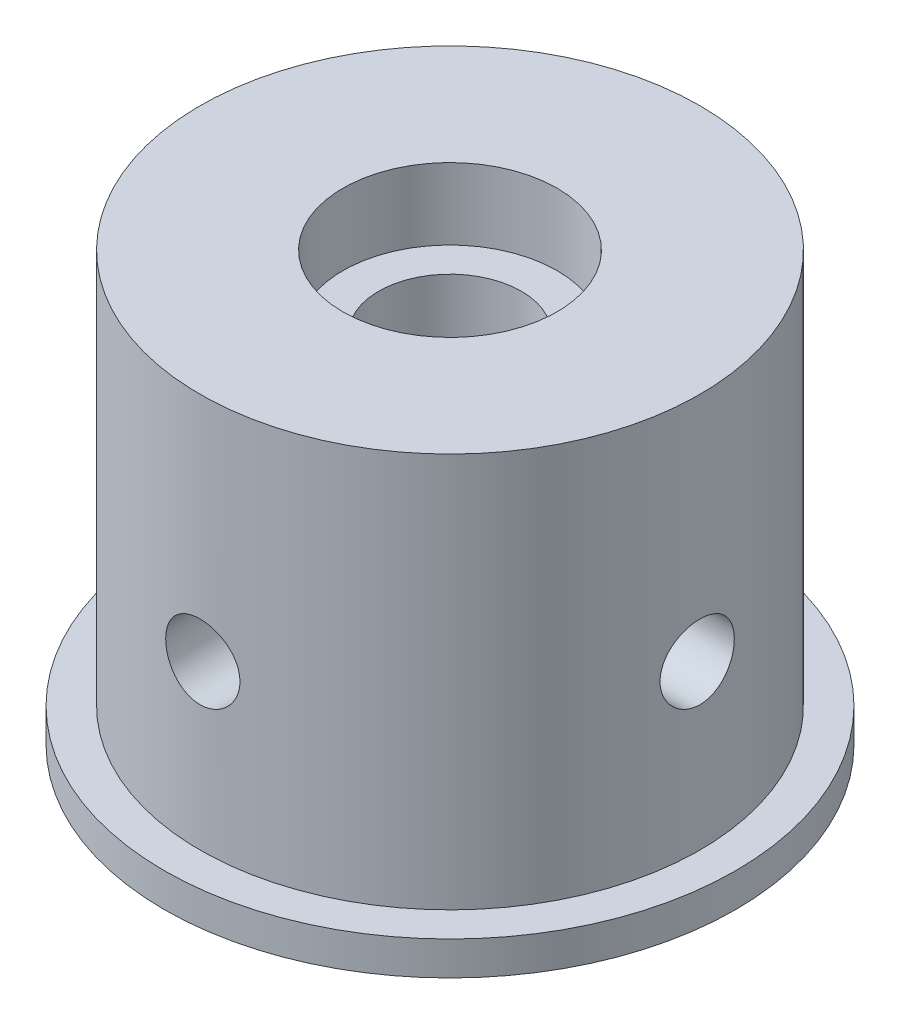
ISO-10303-21;
HEADER;
FILE_DESCRIPTION(('STEP AP214'),'2;1');
FILE_NAME('part.step','',(''),(''),'','','');
FILE_SCHEMA(('AUTOMOTIVE_DESIGN { 1 0 10303 214 1 1 1 1 }'));
ENDSEC;
DATA;
#1=APPLICATION_CONTEXT('core data for automotive mechanical design processes');
#2=APPLICATION_PROTOCOL_DEFINITION('international standard','automotive_design',2000,#1);
#3=PRODUCT_CONTEXT('',#1,'mechanical');
#4=PRODUCT('Part','Part','',(#3));
#5=PRODUCT_RELATED_PRODUCT_CATEGORY('part','',(#4));
#6=PRODUCT_DEFINITION_FORMATION('','',#4);
#7=PRODUCT_DEFINITION_CONTEXT('part definition',#1,'design');
#8=PRODUCT_DEFINITION('design','',#6,#7);
#9=PRODUCT_DEFINITION_SHAPE('','',#8);
#10=(LENGTH_UNIT() NAMED_UNIT(*) SI_UNIT(.MILLI.,.METRE.));
#11=(NAMED_UNIT(*) PLANE_ANGLE_UNIT() SI_UNIT($,.RADIAN.));
#12=(NAMED_UNIT(*) SI_UNIT($,.STERADIAN.) SOLID_ANGLE_UNIT());
#13=UNCERTAINTY_MEASURE_WITH_UNIT(LENGTH_MEASURE(1.E-05),#10,'distance_accuracy_value','');
#14=(GEOMETRIC_REPRESENTATION_CONTEXT(3) GLOBAL_UNCERTAINTY_ASSIGNED_CONTEXT((#13)) GLOBAL_UNIT_ASSIGNED_CONTEXT((#10,
#11,#12)) REPRESENTATION_CONTEXT('',''));
#15=CARTESIAN_POINT('',(0.,0.,0.));
#16=DIRECTION('',(0.,0.,1.));
#17=DIRECTION('',(1.,0.,0.));
#18=AXIS2_PLACEMENT_3D('',#15,#16,#17);
#19=CARTESIAN_POINT('',(0.,-1000.,-3.43024899888577E-12));
#20=DIRECTION('',(0.,-1.,0.));
#21=DIRECTION('',(0.,0.,-1.));
#22=AXIS2_PLACEMENT_3D('',#19,#20,#21);
#23=CYLINDRICAL_SURFACE('',#22,3.17499999999998);
#24=CARTESIAN_POINT('',(0.,12.6999999999999,0.));
#25=DIRECTION('',(0.,-1.,0.));
#26=DIRECTION('',(0.,0.,-1.));
#27=AXIS2_PLACEMENT_3D('',#24,#25,#26);
#28=CIRCLE('',#27,3.17499999999996);
#29=CARTESIAN_POINT('',(0.,12.6999999999999,-3.17499999999992));
#30=VERTEX_POINT('',#29);
#31=EDGE_CURVE('E69',#30,#30,#28,.T.);
#32=ORIENTED_EDGE('',*,*,#31,.F.);
#33=EDGE_LOOP('',(#32));
#34=FACE_BOUND('',#33,.T.);
#35=CARTESIAN_POINT('',(0.,0.,0.));
#36=DIRECTION('',(0.,-1.,0.));
#37=DIRECTION('',(0.,0.,-1.));
#38=AXIS2_PLACEMENT_3D('',#35,#36,#37);
#39=CIRCLE('',#38,3.175);
#40=CARTESIAN_POINT('',(0.,0.,-3.175));
#41=VERTEX_POINT('',#40);
#42=EDGE_CURVE('E10',#41,#41,#39,.T.);
#43=ORIENTED_EDGE('',*,*,#42,.T.);
#44=EDGE_LOOP('',(#43));
#45=FACE_BOUND('',#44,.T.);
#46=ADVANCED_FACE('F35',(#34,#45),#23,.F.);
#47=CARTESIAN_POINT('',(0.,0.,3.175));
#48=DIRECTION('',(0.,1.,0.));
#49=DIRECTION('',(0.,0.,1.));
#50=AXIS2_PLACEMENT_3D('',#47,#48,#49);
#51=PLANE('',#50);
#52=ORIENTED_EDGE('',*,*,#42,.F.);
#53=EDGE_LOOP('',(#52));
#54=FACE_BOUND('',#53,.T.);
#55=CARTESIAN_POINT('',(0.,0.,0.));
#56=DIRECTION('',(0.,-1.,0.));
#57=DIRECTION('',(0.,0.,-1.));
#58=AXIS2_PLACEMENT_3D('',#55,#56,#57);
#59=CIRCLE('',#58,4.7625);
#60=CARTESIAN_POINT('',(0.,0.,-4.7625));
#61=VERTEX_POINT('',#60);
#62=EDGE_CURVE('E41',#61,#61,#59,.T.);
#63=ORIENTED_EDGE('',*,*,#62,.T.);
#64=EDGE_LOOP('',(#63));
#65=FACE_BOUND('',#64,.T.);
#66=ADVANCED_FACE('F104',(#54,#65),#51,.F.);
#67=CARTESIAN_POINT('',(0.,-1000.,-3.43024899888577E-12));
#68=DIRECTION('',(0.,-1.,0.));
#69=DIRECTION('',(0.,0.,-1.));
#70=AXIS2_PLACEMENT_3D('',#67,#68,#69);
#71=CYLINDRICAL_SURFACE('',#70,4.76250000000001);
#72=ORIENTED_EDGE('',*,*,#62,.F.);
#73=EDGE_LOOP('',(#72));
#74=FACE_BOUND('',#73,.T.);
#75=CARTESIAN_POINT('',(0.,-3.17500000000004,0.));
#76=DIRECTION('',(0.,-1.,0.));
#77=DIRECTION('',(0.,0.,-1.));
#78=AXIS2_PLACEMENT_3D('',#75,#76,#77);
#79=CIRCLE('',#78,4.76250000000001);
#80=CARTESIAN_POINT('',(0.,-3.17500000000002,-4.76250000000002));
#81=VERTEX_POINT('',#80);
#82=EDGE_CURVE('E45',#81,#81,#79,.T.);
#83=ORIENTED_EDGE('',*,*,#82,.T.);
#84=EDGE_LOOP('',(#83));
#85=FACE_BOUND('',#84,.T.);
#86=ADVANCED_FACE('F109',(#74,#85),#71,.F.);
#87=CARTESIAN_POINT('',(0.,-3.17499999999999,4.7625));
#88=DIRECTION('',(0.,1.,0.));
#89=DIRECTION('',(0.,0.,1.));
#90=AXIS2_PLACEMENT_3D('',#87,#88,#89);
#91=PLANE('',#90);
#92=ORIENTED_EDGE('',*,*,#82,.F.);
#93=EDGE_LOOP('',(#92));
#94=FACE_BOUND('',#93,.T.);
#95=CARTESIAN_POINT('',(0.,-3.17500000000004,0.));
#96=DIRECTION('',(0.,-1.,0.));
#97=DIRECTION('',(0.,0.,-1.));
#98=AXIS2_PLACEMENT_3D('',#95,#96,#97);
#99=CIRCLE('',#98,12.7);
#100=CARTESIAN_POINT('',(0.,-3.175,-12.7));
#101=VERTEX_POINT('',#100);
#102=EDGE_CURVE('E49',#101,#101,#99,.T.);
#103=ORIENTED_EDGE('',*,*,#102,.T.);
#104=EDGE_LOOP('',(#103));
#105=FACE_BOUND('',#104,.T.);
#106=ADVANCED_FACE('F138',(#94,#105),#91,.F.);
#107=CARTESIAN_POINT('',(0.,-1000.,-3.43024899888577E-12));
#108=DIRECTION('',(0.,-1.,0.));
#109=DIRECTION('',(0.,0.,-1.));
#110=AXIS2_PLACEMENT_3D('',#107,#108,#109);
#111=CYLINDRICAL_SURFACE('',#110,12.7);
#112=ORIENTED_EDGE('',*,*,#102,.F.);
#113=EDGE_LOOP('',(#112));
#114=FACE_BOUND('',#113,.T.);
#115=CARTESIAN_POINT('',(0.,-1.67499999999998,0.));
#116=DIRECTION('',(0.,-1.,0.));
#117=DIRECTION('',(0.,0.,-1.));
#118=AXIS2_PLACEMENT_3D('',#115,#116,#117);
#119=CIRCLE('',#118,12.7);
#120=CARTESIAN_POINT('',(0.,-1.67499999999994,-12.7));
#121=VERTEX_POINT('',#120);
#122=EDGE_CURVE('E54',#121,#121,#119,.T.);
#123=ORIENTED_EDGE('',*,*,#122,.T.);
#124=EDGE_LOOP('',(#123));
#125=FACE_BOUND('',#124,.T.);
#126=ADVANCED_FACE('F134',(#114,#125),#111,.T.);
#127=CARTESIAN_POINT('',(0.,-1.675,12.7));
#128=DIRECTION('',(0.,-1.,0.));
#129=DIRECTION('',(0.,0.,-1.));
#130=AXIS2_PLACEMENT_3D('',#127,#128,#129);
#131=PLANE('',#130);
#132=ORIENTED_EDGE('',*,*,#122,.F.);
#133=EDGE_LOOP('',(#132));
#134=FACE_BOUND('',#133,.T.);
#135=CARTESIAN_POINT('',(0.,-1.67499999999998,0.));
#136=DIRECTION('',(0.,-1.,0.));
#137=DIRECTION('',(0.,0.,-1.));
#138=AXIS2_PLACEMENT_3D('',#135,#136,#137);
#139=CIRCLE('',#138,11.1125);
#140=CARTESIAN_POINT('',(0.,-1.67499999999994,-11.1125));
#141=VERTEX_POINT('',#140);
#142=EDGE_CURVE('E57',#141,#141,#139,.T.);
#143=ORIENTED_EDGE('',*,*,#142,.T.);
#144=EDGE_LOOP('',(#143));
#145=FACE_BOUND('',#144,.T.);
#146=ADVANCED_FACE('F130',(#134,#145),#131,.F.);
#147=CARTESIAN_POINT('',(0.,-1000.,-3.43024899888577E-12));
#148=DIRECTION('',(0.,-1.,0.));
#149=DIRECTION('',(0.,0.,-1.));
#150=AXIS2_PLACEMENT_3D('',#147,#148,#149);
#151=CYLINDRICAL_SURFACE('',#150,11.1125);
#152=CARTESIAN_POINT('',(-1.64999999999998,5.57500000000002,10.989320099533));
#153=CARTESIAN_POINT('',(-1.64999618659981,5.48286853543193,10.9893216275905));
#154=CARTESIAN_POINT('',(-1.64225735815435,5.39068331955539,10.9904912429801));
#155=CARTESIAN_POINT('',(-1.61151429191547,5.20888950658976,10.9950402519829));
#156=CARTESIAN_POINT('',(-1.58849509450304,5.11928352437843,10.9984218110616));
#157=CARTESIAN_POINT('',(-1.52789448606151,4.94530595837423,11.0070034516113));
#158=CARTESIAN_POINT('',(-1.49032416552035,4.86093044473399,11.0122021478141));
#159=CARTESIAN_POINT('',(-1.40171376180664,4.69969338000087,11.0238306537277));
#160=CARTESIAN_POINT('',(-1.35067556233931,4.62283078016167,11.0302602912366));
#161=CARTESIAN_POINT('',(-1.23615039373076,4.47818608641399,11.0436826393442));
#162=CARTESIAN_POINT('',(-1.17257858407137,4.41047149546176,11.0506789844641));
#163=CARTESIAN_POINT('',(-1.03497393414699,4.2866298357452,11.0644139812911));
#164=CARTESIAN_POINT('',(-0.960940522791229,4.23050339998126,11.0711526189047));
#165=CARTESIAN_POINT('',(-0.80408225145622,4.13118263139032,11.0836509156003));
#166=CARTESIAN_POINT('',(-0.721217661622767,4.08805039484082,11.0894058187753));
#167=CARTESIAN_POINT('',(-0.549320495088172,4.01634083309696,11.0992479888596));
#168=CARTESIAN_POINT('',(-0.460288238135389,3.98776275401669,11.1033353421437));
#169=CARTESIAN_POINT('',(-0.279277956940868,3.94617718534609,11.1093562405192));
#170=CARTESIAN_POINT('',(-0.187326419747715,3.93305670351523,11.1113054080426));
#171=CARTESIAN_POINT('',(-0.0025076172022686,3.92240796680425,11.1128838468828));
#172=CARTESIAN_POINT('',(0.0903595979453972,3.92487886177708,11.1125132446891));
#173=CARTESIAN_POINT('',(0.273602836260969,3.94525347900003,11.1095063936601));
#174=CARTESIAN_POINT('',(0.363992709872153,3.96303564189439,11.1068879910719));
#175=CARTESIAN_POINT('',(0.540491168608319,4.01333726696773,11.0996996332083));
#176=CARTESIAN_POINT('',(0.626599645291032,4.04585710222216,11.0951296285293));
#177=CARTESIAN_POINT('',(0.792459487764749,4.12483571390152,11.0845208720564));
#178=CARTESIAN_POINT('',(0.87218608240985,4.17134575826498,11.0784767338956));
#179=CARTESIAN_POINT('',(1.02274890645373,4.27694711694705,11.0655934970277));
#180=CARTESIAN_POINT('',(1.09358456178974,4.33603924299151,11.0587543470439));
#181=CARTESIAN_POINT('',(1.22507113980978,4.46580477622274,11.0449661840708));
#182=CARTESIAN_POINT('',(1.28561733515512,4.53658430281297,11.0380167474928));
#183=CARTESIAN_POINT('',(1.39398877185937,4.68735466200376,11.0248555976473));
#184=CARTESIAN_POINT('',(1.44181393784302,4.7673455491799,11.0186438887512));
#185=CARTESIAN_POINT('',(1.52339934791994,4.93437610270183,11.007661638591));
#186=CARTESIAN_POINT('',(1.55714898332093,5.02142102685945,11.002892185093));
#187=CARTESIAN_POINT('',(1.6095207611076,5.20003025071901,10.9953538301128));
#188=CARTESIAN_POINT('',(1.62814394708329,5.2915942381835,10.9925847906214));
#189=CARTESIAN_POINT('',(1.6495908757713,5.47571109742418,10.9893868999923));
#190=CARTESIAN_POINT('',(1.65256300592294,5.56824631583585,10.9889360709001));
#191=CARTESIAN_POINT('',(1.6430170496153,5.75249353764115,10.9903673101815));
#192=CARTESIAN_POINT('',(1.63049943378522,5.84420556596071,10.9922493076762));
#193=CARTESIAN_POINT('',(1.59045510780202,6.02374431768596,10.9981139659201));
#194=CARTESIAN_POINT('',(1.5630021887814,6.11158786642527,11.0020862957919));
#195=CARTESIAN_POINT('',(1.4939432510218,6.28142644490373,11.0116755269427));
#196=CARTESIAN_POINT('',(1.4523365462927,6.36342119093649,11.0172925079311));
#197=CARTESIAN_POINT('',(1.3557940334336,6.51990021764518,11.0295899847129));
#198=CARTESIAN_POINT('',(1.3007620872646,6.5943245810529,11.0362780260457));
#199=CARTESIAN_POINT('',(1.17906504058945,6.73293457119733,11.0499412615486));
#200=CARTESIAN_POINT('',(1.11239929594918,6.79711963063272,11.0569164716022));
#201=CARTESIAN_POINT('',(0.968673898722726,6.91396117831893,11.0704367261392));
#202=CARTESIAN_POINT('',(0.891533916897174,6.96651938188481,11.076977798716));
#203=CARTESIAN_POINT('',(0.729433686899524,7.05793083119652,11.0888312104464));
#204=CARTESIAN_POINT('',(0.644473649221561,7.09678444569578,11.0941435826598));
#205=CARTESIAN_POINT('',(0.469453159725739,7.15952641810518,11.1029236158221));
#206=CARTESIAN_POINT('',(0.37941239133949,7.18346871482536,11.1063979186819));
#207=CARTESIAN_POINT('',(0.196533055895886,7.2158830423669,11.11113821481));
#208=CARTESIAN_POINT('',(0.103694670132233,7.22435607345936,11.1124043508623));
#209=CARTESIAN_POINT('',(-0.0811908889919191,7.22556731397851,11.1125842733386));
#210=CARTESIAN_POINT('',(-0.173237090198523,7.21845598209299,11.1115205533306));
#211=CARTESIAN_POINT('',(-0.354809520239015,7.18902260988698,11.1072055977688));
#212=CARTESIAN_POINT('',(-0.44433575666396,7.1667006153917,11.1039543688053));
#213=CARTESIAN_POINT('',(-0.618287019833966,7.10753254458865,11.0956280108046));
#214=CARTESIAN_POINT('',(-0.702715584766803,7.07069667886532,11.0905541642097));
#215=CARTESIAN_POINT('',(-0.864217269955648,6.98356250875083,11.0791401600828));
#216=CARTESIAN_POINT('',(-0.941290161006708,6.93326378503876,11.07279996311));
#217=CARTESIAN_POINT('',(-1.0866562118642,6.82008679029522,11.059485483991));
#218=CARTESIAN_POINT('',(-1.15486235337423,6.75709736328976,11.0525059190431));
#219=CARTESIAN_POINT('',(-1.27979143802747,6.6205608052989,11.0387386344333));
#220=CARTESIAN_POINT('',(-1.33651168119221,6.54701119887089,11.0319509602009));
#221=CARTESIAN_POINT('',(-1.43713821454582,6.39096714038507,11.0192959755854));
#222=CARTESIAN_POINT('',(-1.48097233190512,6.30842572847873,11.013433931072));
#223=CARTESIAN_POINT('',(-1.55408967254404,6.1371045326336,11.0033556548974));
#224=CARTESIAN_POINT('',(-1.5833880442941,6.04833135378717,10.999137710819));
#225=CARTESIAN_POINT('',(-1.61992885217467,5.8951294519109,10.9938029887798));
#226=CARTESIAN_POINT('',(-1.631188347619,5.8316483757099,10.9921307825552));
#227=CARTESIAN_POINT('',(-1.64622520746184,5.70378694827514,10.989888810744));
#228=CARTESIAN_POINT('',(-1.65000266584463,5.63940660834755,10.9893190313094));
#229=CARTESIAN_POINT('',(-1.64999999999998,5.57500000000002,10.989320099533));
#230=B_SPLINE_CURVE_WITH_KNOTS('',3,(#152,#153,#154,#155,#156,#157,#158,#159,#160,#161,#162,
#163,#164,#165,#166,#167,#168,#169,#170,#171,#172,#173,#174,#175,#176,#177,#178,#179,#180,#181,
#182,#183,#184,#185,#186,#187,#188,#189,#190,#191,#192,#193,#194,#195,#196,#197,#198,#199,#200,
#201,#202,#203,#204,#205,#206,#207,#208,#209,#210,#211,#212,#213,#214,#215,#216,#217,#218,#219,
#220,#221,#222,#223,#224,#225,#226,#227,#228,#229),.UNSPECIFIED.,.T.,.F.,(4,2,2,2,2,2,2,2,2,2,2,
2,2,2,2,2,2,2,2,2,2,2,2,2,2,2,2,2,2,2,2,2,2,2,2,2,2,2,4),(0.,0.276158988725957,
0.552588739118696,0.828808215239548,1.10498907796516,1.38310791439789,1.66124193899285,
1.94068475486998,2.22011309451008,2.49748593410564,2.7748436495937,3.05001945681757,
3.32520223034335,3.60140597360623,3.87762754139897,4.15651101907358,4.43539614916524,
4.71449109607343,4.9935667862852,5.26999173677526,5.5464082887763,5.82147138570116,
6.09654781598148,6.3736550748733,6.65077768136684,6.93016023642604,7.20953527348257,
7.48789376461151,7.76623425593243,8.04189936687315,8.31756364732053,8.5930343417737,
8.86851361717355,9.14651977224075,9.42459120226531,9.70419161751594,9.98350003105494,
10.1765577159361,10.3696129757423),.UNSPECIFIED.);
#231=CARTESIAN_POINT('',(-1.64999999999998,5.57500000000002,10.989320099533));
#232=VERTEX_POINT('',#231);
#233=EDGE_CURVE('E266',#232,#232,#230,.T.);
#234=ORIENTED_EDGE('',*,*,#233,.F.);
#235=EDGE_LOOP('',(#234));
#236=FACE_BOUND('',#235,.T.);
#237=CARTESIAN_POINT('',(10.989320099533,5.57500000000006,1.65000000000004));
#238=CARTESIAN_POINT('',(10.9893216275905,5.48286853543197,1.64999618659987));
#239=CARTESIAN_POINT('',(10.9904912429801,5.39068331955542,1.64225735815441));
#240=CARTESIAN_POINT('',(10.9950402519829,5.2088895065898,1.61151429191552));
#241=CARTESIAN_POINT('',(10.9984218110616,5.11928352437846,1.5884950945031));
#242=CARTESIAN_POINT('',(11.0070034516113,4.94530595837427,1.52789448606157));
#243=CARTESIAN_POINT('',(11.0122021478141,4.86093044473403,1.4903241655204));
#244=CARTESIAN_POINT('',(11.0238306537277,4.6996933800009,1.4017137618067));
#245=CARTESIAN_POINT('',(11.0302602912365,4.62283078016171,1.35067556233937));
#246=CARTESIAN_POINT('',(11.0436826393442,4.47818608641403,1.23615039373082));
#247=CARTESIAN_POINT('',(11.050678984464,4.4104714954618,1.17257858407143));
#248=CARTESIAN_POINT('',(11.0644139812911,4.28662983574524,1.03497393414705));
#249=CARTESIAN_POINT('',(11.0711526189047,4.23050339998129,0.960940522791286));
#250=CARTESIAN_POINT('',(11.0836509156003,4.13118263139036,0.804082251456277));
#251=CARTESIAN_POINT('',(11.0894058187753,4.08805039484086,0.721217661622825));
#252=CARTESIAN_POINT('',(11.0992479888596,4.01634083309699,0.54932049508823));
#253=CARTESIAN_POINT('',(11.1033353421437,3.98776275401673,0.460288238135447));
#254=CARTESIAN_POINT('',(11.1093562405192,3.94617718534612,0.279277956940926));
#255=CARTESIAN_POINT('',(11.1113054080426,3.93305670351527,0.187326419747773));
#256=CARTESIAN_POINT('',(11.1128838468828,3.92240796680429,0.00250761720232645));
#257=CARTESIAN_POINT('',(11.1125132446891,3.92487886177712,-0.0903595979453396));
#258=CARTESIAN_POINT('',(11.10950639366,3.94525347900007,-0.273602836260911));
#259=CARTESIAN_POINT('',(11.1068879910719,3.96303564189443,-0.363992709872096));
#260=CARTESIAN_POINT('',(11.0996996332083,4.01333726696777,-0.540491168608262));
#261=CARTESIAN_POINT('',(11.0951296285293,4.04585710222219,-0.626599645290975));
#262=CARTESIAN_POINT('',(11.0845208720564,4.12483571390155,-0.792459487764692));
#263=CARTESIAN_POINT('',(11.0784767338956,4.17134575826502,-0.872186082409793));
#264=CARTESIAN_POINT('',(11.0655934970277,4.27694711694709,-1.02274890645368));
#265=CARTESIAN_POINT('',(11.0587543470438,4.33603924299155,-1.09358456178968));
#266=CARTESIAN_POINT('',(11.0449661840708,4.46580477622277,-1.22507113980973));
#267=CARTESIAN_POINT('',(11.0380167474928,4.536584302813,-1.28561733515506));
#268=CARTESIAN_POINT('',(11.0248555976473,4.6873546620038,-1.39398877185931));
#269=CARTESIAN_POINT('',(11.0186438887511,4.76734554917994,-1.44181393784296));
#270=CARTESIAN_POINT('',(11.007661638591,4.93437610270187,-1.52339934791988));
#271=CARTESIAN_POINT('',(11.002892185093,5.02142102685949,-1.55714898332087));
#272=CARTESIAN_POINT('',(10.9953538301128,5.20003025071905,-1.60952076110754));
#273=CARTESIAN_POINT('',(10.9925847906214,5.29159423818354,-1.62814394708323));
#274=CARTESIAN_POINT('',(10.9893868999923,5.47571109742421,-1.64959087577124));
#275=CARTESIAN_POINT('',(10.9889360709001,5.56824631583589,-1.65256300592289));
#276=CARTESIAN_POINT('',(10.9903673101815,5.75249353764119,-1.64301704961524));
#277=CARTESIAN_POINT('',(10.9922493076762,5.84420556596075,-1.63049943378517));
#278=CARTESIAN_POINT('',(10.9981139659201,6.023744317686,-1.59045510780196));
#279=CARTESIAN_POINT('',(11.0020862957918,6.11158786642531,-1.56300218878134));
#280=CARTESIAN_POINT('',(11.0116755269427,6.28142644490377,-1.49394325102174));
#281=CARTESIAN_POINT('',(11.017292507931,6.36342119093653,-1.45233654629264));
#282=CARTESIAN_POINT('',(11.0295899847129,6.51990021764522,-1.35579403343355));
#283=CARTESIAN_POINT('',(11.0362780260456,6.59432458105294,-1.30076208726454));
#284=CARTESIAN_POINT('',(11.0499412615485,6.73293457119737,-1.17906504058939));
#285=CARTESIAN_POINT('',(11.0569164716021,6.79711963063276,-1.11239929594912));
#286=CARTESIAN_POINT('',(11.0704367261392,6.91396117831897,-0.968673898722668));
#287=CARTESIAN_POINT('',(11.076977798716,6.96651938188485,-0.891533916897116));
#288=CARTESIAN_POINT('',(11.0888312104464,7.05793083119656,-0.729433686899466));
#289=CARTESIAN_POINT('',(11.0941435826598,7.09678444569582,-0.644473649221503));
#290=CARTESIAN_POINT('',(11.1029236158221,7.15952641810522,-0.46945315972568));
#291=CARTESIAN_POINT('',(11.1063979186819,7.18346871482539,-0.37941239133943));
#292=CARTESIAN_POINT('',(11.11113821481,7.21588304236694,-0.196533055895827));
#293=CARTESIAN_POINT('',(11.1124043508623,7.2243560734594,-0.103694670132174));
#294=CARTESIAN_POINT('',(11.1125842733386,7.22556731397854,0.0811908889919779));
#295=CARTESIAN_POINT('',(11.1115205533306,7.21845598209303,0.173237090198582));
#296=CARTESIAN_POINT('',(11.1072055977687,7.18902260988702,0.354809520239073));
#297=CARTESIAN_POINT('',(11.1039543688052,7.16670061539173,0.444335756664019));
#298=CARTESIAN_POINT('',(11.0956280108046,7.10753254458868,0.618287019834024));
#299=CARTESIAN_POINT('',(11.0905541642097,7.07069667886535,0.702715584766861));
#300=CARTESIAN_POINT('',(11.0791401600828,6.98356250875086,0.864217269955706));
#301=CARTESIAN_POINT('',(11.07279996311,6.93326378503879,0.941290161006767));
#302=CARTESIAN_POINT('',(11.059485483991,6.82008679029525,1.08665621186426));
#303=CARTESIAN_POINT('',(11.0525059190431,6.7570973632898,1.15486235337428));
#304=CARTESIAN_POINT('',(11.0387386344333,6.62056080529893,1.27979143802753));
#305=CARTESIAN_POINT('',(11.0319509602008,6.54701119887092,1.33651168119226));
#306=CARTESIAN_POINT('',(11.0192959755854,6.3909671403851,1.43713821454588));
#307=CARTESIAN_POINT('',(11.013433931072,6.30842572847876,1.48097233190518));
#308=CARTESIAN_POINT('',(11.0033556548973,6.13710453263364,1.5540896725441));
#309=CARTESIAN_POINT('',(10.999137710819,6.04833135378721,1.58338804429416));
#310=CARTESIAN_POINT('',(10.9938029887798,5.89512945191094,1.61992885217473));
#311=CARTESIAN_POINT('',(10.9921307825552,5.83164837570994,1.63118834761906));
#312=CARTESIAN_POINT('',(10.9898888107439,5.70378694827518,1.6462252074619));
#313=CARTESIAN_POINT('',(10.9893190313094,5.63940660834758,1.65000266584468));
#314=CARTESIAN_POINT('',(10.989320099533,5.57500000000006,1.65000000000004));
#315=B_SPLINE_CURVE_WITH_KNOTS('',3,(#237,#238,#239,#240,#241,#242,#243,#244,#245,#246,#247,
#248,#249,#250,#251,#252,#253,#254,#255,#256,#257,#258,#259,#260,#261,#262,#263,#264,#265,#266,
#267,#268,#269,#270,#271,#272,#273,#274,#275,#276,#277,#278,#279,#280,#281,#282,#283,#284,#285,
#286,#287,#288,#289,#290,#291,#292,#293,#294,#295,#296,#297,#298,#299,#300,#301,#302,#303,#304,
#305,#306,#307,#308,#309,#310,#311,#312,#313,#314),.UNSPECIFIED.,.T.,.F.,(4,2,2,2,2,2,2,2,2,2,2,
2,2,2,2,2,2,2,2,2,2,2,2,2,2,2,2,2,2,2,2,2,2,2,2,2,2,2,4),(0.,0.276158988725958,
0.552588739118696,0.828808215239549,1.10498907796516,1.38310791439789,1.66124193899285,
1.94068475486997,2.22011309451008,2.49748593410564,2.7748436495937,3.05001945681757,
3.32520223034335,3.60140597360623,3.87762754139898,4.15651101907358,4.43539614916524,
4.71449109607343,4.9935667862852,5.26999173677526,5.5464082887763,5.82147138570116,
6.09654781598148,6.37365507487331,6.65077768136684,6.93016023642604,7.20953527348257,
7.48789376461151,7.76623425593243,8.04189936687315,8.31756364732053,8.59303434177371,
8.86851361717355,9.14651977224076,9.42459120226531,9.70419161751594,9.98350003105494,
10.1765577159361,10.3696129757423),.UNSPECIFIED.);
#316=CARTESIAN_POINT('',(10.989320099533,5.57500000000006,1.65000000000004));
#317=VERTEX_POINT('',#316);
#318=EDGE_CURVE('E277',#317,#317,#315,.T.);
#319=ORIENTED_EDGE('',*,*,#318,.F.);
#320=EDGE_LOOP('',(#319));
#321=FACE_BOUND('',#320,.T.);
#322=CARTESIAN_POINT('',(1.64999999999996,5.57500000000008,-10.989320099533));
#323=CARTESIAN_POINT('',(1.64999618659979,5.48286853543199,-10.9893216275905));
#324=CARTESIAN_POINT('',(1.64225735815433,5.39068331955544,-10.9904912429801));
#325=CARTESIAN_POINT('',(1.61151429191545,5.20888950658982,-10.9950402519829));
#326=CARTESIAN_POINT('',(1.58849509450302,5.11928352437848,-10.9984218110616));
#327=CARTESIAN_POINT('',(1.52789448606149,4.94530595837429,-11.0070034516113));
#328=CARTESIAN_POINT('',(1.49032416552033,4.86093044473404,-11.0122021478141));
#329=CARTESIAN_POINT('',(1.40171376180662,4.69969338000092,-11.0238306537277));
#330=CARTESIAN_POINT('',(1.35067556233929,4.62283078016173,-11.0302602912365));
#331=CARTESIAN_POINT('',(1.23615039373074,4.47818608641405,-11.0436826393442));
#332=CARTESIAN_POINT('',(1.17257858407135,4.41047149546182,-11.050678984464));
#333=CARTESIAN_POINT('',(1.03497393414697,4.28662983574526,-11.0644139812911));
#334=CARTESIAN_POINT('',(0.96094052279121,4.23050339998131,-11.0711526189047));
#335=CARTESIAN_POINT('',(0.804082251456202,4.13118263139038,-11.0836509156003));
#336=CARTESIAN_POINT('',(0.721217661622749,4.08805039484088,-11.0894058187752));
#337=CARTESIAN_POINT('',(0.549320495088153,4.01634083309701,-11.0992479888596));
#338=CARTESIAN_POINT('',(0.460288238135371,3.98776275401675,-11.1033353421437));
#339=CARTESIAN_POINT('',(0.27927795694085,3.94617718534614,-11.1093562405192));
#340=CARTESIAN_POINT('',(0.187326419747696,3.93305670351529,-11.1113054080426));
#341=CARTESIAN_POINT('',(0.00250761720224996,3.92240796680431,-11.1128838468828));
#342=CARTESIAN_POINT('',(-0.0903595979454159,3.92487886177714,-11.1125132446891));
#343=CARTESIAN_POINT('',(-0.273602836260988,3.94525347900009,-11.10950639366));
#344=CARTESIAN_POINT('',(-0.363992709872172,3.96303564189445,-11.1068879910719));
#345=CARTESIAN_POINT('',(-0.540491168608339,4.01333726696778,-11.0996996332083));
#346=CARTESIAN_POINT('',(-0.626599645291052,4.04585710222221,-11.0951296285293));
#347=CARTESIAN_POINT('',(-0.792459487764769,4.12483571390157,-11.0845208720564));
#348=CARTESIAN_POINT('',(-0.872186082409869,4.17134575826504,-11.0784767338955));
#349=CARTESIAN_POINT('',(-1.02274890645375,4.27694711694711,-11.0655934970277));
#350=CARTESIAN_POINT('',(-1.09358456178975,4.33603924299156,-11.0587543470438));
#351=CARTESIAN_POINT('',(-1.2250711398098,4.46580477622279,-11.0449661840708));
#352=CARTESIAN_POINT('',(-1.28561733515514,4.53658430281302,-11.0380167474928));
#353=CARTESIAN_POINT('',(-1.39398877185939,4.68735466200382,-11.0248555976473));
#354=CARTESIAN_POINT('',(-1.44181393784304,4.76734554917996,-11.0186438887511));
#355=CARTESIAN_POINT('',(-1.52339934791996,4.93437610270189,-11.007661638591));
#356=CARTESIAN_POINT('',(-1.55714898332095,5.0214210268595,-11.002892185093));
#357=CARTESIAN_POINT('',(-1.60952076110762,5.20003025071906,-10.9953538301128));
#358=CARTESIAN_POINT('',(-1.62814394708331,5.29159423818356,-10.9925847906214));
#359=CARTESIAN_POINT('',(-1.64959087577132,5.47571109742423,-10.9893868999922));
#360=CARTESIAN_POINT('',(-1.65256300592296,5.5682463158359,-10.9889360709001));
#361=CARTESIAN_POINT('',(-1.64301704961532,5.7524935376412,-10.9903673101815));
#362=CARTESIAN_POINT('',(-1.63049943378524,5.84420556596076,-10.9922493076761));
#363=CARTESIAN_POINT('',(-1.59045510780204,6.02374431768602,-10.9981139659201));
#364=CARTESIAN_POINT('',(-1.56300218878142,6.11158786642533,-11.0020862957918));
#365=CARTESIAN_POINT('',(-1.49394325102182,6.28142644490378,-11.0116755269426));
#366=CARTESIAN_POINT('',(-1.45233654629272,6.36342119093654,-11.017292507931));
#367=CARTESIAN_POINT('',(-1.35579403343362,6.51990021764524,-11.0295899847129));
#368=CARTESIAN_POINT('',(-1.30076208726462,6.59432458105295,-11.0362780260456));
#369=CARTESIAN_POINT('',(-1.17906504058947,6.73293457119738,-11.0499412615485));
#370=CARTESIAN_POINT('',(-1.1123992959492,6.79711963063278,-11.0569164716021));
#371=CARTESIAN_POINT('',(-0.968673898722747,6.91396117831898,-11.0704367261392));
#372=CARTESIAN_POINT('',(-0.891533916897194,6.96651938188487,-11.076977798716));
#373=CARTESIAN_POINT('',(-0.729433686899544,7.05793083119658,-11.0888312104464));
#374=CARTESIAN_POINT('',(-0.644473649221581,7.09678444569584,-11.0941435826597));
#375=CARTESIAN_POINT('',(-0.469453159725758,7.15952641810524,-11.1029236158221));
#376=CARTESIAN_POINT('',(-0.379412391339509,7.18346871482541,-11.1063979186819));
#377=CARTESIAN_POINT('',(-0.196533055895905,7.21588304236696,-11.11113821481));
#378=CARTESIAN_POINT('',(-0.103694670132253,7.22435607345941,-11.1124043508622));
#379=CARTESIAN_POINT('',(0.0811908889918997,7.22556731397856,-11.1125842733385));
#380=CARTESIAN_POINT('',(0.173237090198504,7.21845598209304,-11.1115205533305));
#381=CARTESIAN_POINT('',(0.354809520238995,7.18902260988704,-11.1072055977687));
#382=CARTESIAN_POINT('',(0.44433575666394,7.16670061539175,-11.1039543688052));
#383=CARTESIAN_POINT('',(0.618287019833946,7.1075325445887,-11.0956280108046));
#384=CARTESIAN_POINT('',(0.702715584766782,7.07069667886537,-11.0905541642097));
#385=CARTESIAN_POINT('',(0.864217269955627,6.98356250875088,-11.0791401600827));
#386=CARTESIAN_POINT('',(0.941290161006688,6.93326378503881,-11.0727999631099));
#387=CARTESIAN_POINT('',(1.08665621186418,6.82008679029527,-11.059485483991));
#388=CARTESIAN_POINT('',(1.15486235337421,6.75709736328982,-11.0525059190431));
#389=CARTESIAN_POINT('',(1.27979143802745,6.62056080529895,-11.0387386344332));
#390=CARTESIAN_POINT('',(1.33651168119219,6.54701119887094,-11.0319509602008));
#391=CARTESIAN_POINT('',(1.4371382145458,6.39096714038512,-11.0192959755853));
#392=CARTESIAN_POINT('',(1.4809723319051,6.30842572847878,-11.013433931072));
#393=CARTESIAN_POINT('',(1.55408967254402,6.13710453263366,-11.0033556548973));
#394=CARTESIAN_POINT('',(1.58338804429408,6.04833135378723,-10.999137710819));
#395=CARTESIAN_POINT('',(1.61992885217465,5.89512945191095,-10.9938029887798));
#396=CARTESIAN_POINT('',(1.63118834761898,5.83164837570996,-10.9921307825552));
#397=CARTESIAN_POINT('',(1.64622520746182,5.7037869482752,-10.9898888107439));
#398=CARTESIAN_POINT('',(1.65000266584461,5.6394066083476,-10.9893190313094));
#399=CARTESIAN_POINT('',(1.64999999999996,5.57500000000008,-10.989320099533));
#400=B_SPLINE_CURVE_WITH_KNOTS('',3,(#322,#323,#324,#325,#326,#327,#328,#329,#330,#331,#332,
#333,#334,#335,#336,#337,#338,#339,#340,#341,#342,#343,#344,#345,#346,#347,#348,#349,#350,#351,
#352,#353,#354,#355,#356,#357,#358,#359,#360,#361,#362,#363,#364,#365,#366,#367,#368,#369,#370,
#371,#372,#373,#374,#375,#376,#377,#378,#379,#380,#381,#382,#383,#384,#385,#386,#387,#388,#389,
#390,#391,#392,#393,#394,#395,#396,#397,#398,#399),.UNSPECIFIED.,.T.,.F.,(4,2,2,2,2,2,2,2,2,2,2,
2,2,2,2,2,2,2,2,2,2,2,2,2,2,2,2,2,2,2,2,2,2,2,2,2,2,2,4),(0.,0.276158988725957,
0.552588739118695,0.828808215239547,1.10498907796516,1.38310791439789,1.66124193899284,
1.94068475486997,2.22011309451008,2.49748593410564,2.7748436495937,3.05001945681757,
3.32520223034335,3.60140597360623,3.87762754139897,4.15651101907358,4.43539614916524,
4.71449109607343,4.9935667862852,5.26999173677526,5.5464082887763,5.82147138570116,
6.09654781598148,6.3736550748733,6.65077768136684,6.93016023642604,7.20953527348257,
7.48789376461151,7.76623425593243,8.04189936687315,8.31756364732053,8.5930343417737,
8.86851361717355,9.14651977224075,9.42459120226531,9.70419161751594,9.98350003105494,
10.1765577159361,10.3696129757423),.UNSPECIFIED.);
#401=CARTESIAN_POINT('',(1.64999999999996,5.57500000000008,-10.989320099533));
#402=VERTEX_POINT('',#401);
#403=EDGE_CURVE('E278',#402,#402,#400,.T.);
#404=ORIENTED_EDGE('',*,*,#403,.F.);
#405=EDGE_LOOP('',(#404));
#406=FACE_BOUND('',#405,.T.);
#407=CARTESIAN_POINT('',(-10.989320099533,5.57500000000006,-1.65));
#408=CARTESIAN_POINT('',(-10.9893216275905,5.48286853543197,-1.64999618659983));
#409=CARTESIAN_POINT('',(-10.9904912429801,5.39068331955542,-1.64225735815437));
#410=CARTESIAN_POINT('',(-10.9950402519829,5.2088895065898,-1.61151429191549));
#411=CARTESIAN_POINT('',(-10.9984218110616,5.11928352437846,-1.58849509450306));
#412=CARTESIAN_POINT('',(-11.0070034516113,4.94530595837427,-1.52789448606153));
#413=CARTESIAN_POINT('',(-11.0122021478141,4.86093044473403,-1.49032416552037));
#414=CARTESIAN_POINT('',(-11.0238306537277,4.69969338000091,-1.40171376180666));
#415=CARTESIAN_POINT('',(-11.0302602912366,4.62283078016171,-1.35067556233933));
#416=CARTESIAN_POINT('',(-11.0436826393442,4.47818608641403,-1.23615039373078));
#417=CARTESIAN_POINT('',(-11.050678984464,4.4104714954618,-1.17257858407139));
#418=CARTESIAN_POINT('',(-11.0644139812911,4.28662983574524,-1.03497393414701));
#419=CARTESIAN_POINT('',(-11.0711526189047,4.23050339998129,-0.960940522791248));
#420=CARTESIAN_POINT('',(-11.0836509156003,4.13118263139036,-0.804082251456239));
#421=CARTESIAN_POINT('',(-11.0894058187753,4.08805039484086,-0.721217661622787));
#422=CARTESIAN_POINT('',(-11.0992479888596,4.01634083309699,-0.549320495088191));
#423=CARTESIAN_POINT('',(-11.1033353421437,3.98776275401673,-0.460288238135409));
#424=CARTESIAN_POINT('',(-11.1093562405192,3.94617718534612,-0.279277956940888));
#425=CARTESIAN_POINT('',(-11.1113054080426,3.93305670351527,-0.187326419747734));
#426=CARTESIAN_POINT('',(-11.1128838468828,3.92240796680429,-0.00250761720228808));
#427=CARTESIAN_POINT('',(-11.1125132446891,3.92487886177712,0.0903595979453778));
#428=CARTESIAN_POINT('',(-11.10950639366,3.94525347900007,0.273602836260949));
#429=CARTESIAN_POINT('',(-11.1068879910719,3.96303564189443,0.363992709872134));
#430=CARTESIAN_POINT('',(-11.0996996332083,4.01333726696777,0.5404911686083));
#431=CARTESIAN_POINT('',(-11.0951296285293,4.04585710222219,0.626599645291013));
#432=CARTESIAN_POINT('',(-11.0845208720564,4.12483571390155,0.79245948776473));
#433=CARTESIAN_POINT('',(-11.0784767338956,4.17134575826502,0.872186082409831));
#434=CARTESIAN_POINT('',(-11.0655934970277,4.27694711694709,1.02274890645371));
#435=CARTESIAN_POINT('',(-11.0587543470438,4.33603924299155,1.09358456178972));
#436=CARTESIAN_POINT('',(-11.0449661840708,4.46580477622277,1.22507113980977));
#437=CARTESIAN_POINT('',(-11.0380167474928,4.536584302813,1.2856173351551));
#438=CARTESIAN_POINT('',(-11.0248555976473,4.6873546620038,1.39398877185935));
#439=CARTESIAN_POINT('',(-11.0186438887511,4.76734554917994,1.441813937843));
#440=CARTESIAN_POINT('',(-11.007661638591,4.93437610270187,1.52339934791992));
#441=CARTESIAN_POINT('',(-11.002892185093,5.02142102685949,1.55714898332091));
#442=CARTESIAN_POINT('',(-10.9953538301128,5.20003025071905,1.60952076110758));
#443=CARTESIAN_POINT('',(-10.9925847906214,5.29159423818354,1.62814394708327));
#444=CARTESIAN_POINT('',(-10.9893868999923,5.47571109742421,1.64959087577128));
#445=CARTESIAN_POINT('',(-10.9889360709001,5.56824631583589,1.65256300592292));
#446=CARTESIAN_POINT('',(-10.9903673101815,5.75249353764119,1.64301704961528));
#447=CARTESIAN_POINT('',(-10.9922493076762,5.84420556596075,1.6304994337852));
#448=CARTESIAN_POINT('',(-10.9981139659201,6.023744317686,1.590455107802));
#449=CARTESIAN_POINT('',(-11.0020862957918,6.11158786642531,1.56300218878138));
#450=CARTESIAN_POINT('',(-11.0116755269427,6.28142644490376,1.49394325102178));
#451=CARTESIAN_POINT('',(-11.017292507931,6.36342119093652,1.45233654629268));
#452=CARTESIAN_POINT('',(-11.0295899847129,6.51990021764522,1.35579403343358));
#453=CARTESIAN_POINT('',(-11.0362780260456,6.59432458105293,1.30076208726458));
#454=CARTESIAN_POINT('',(-11.0499412615485,6.73293457119737,1.17906504058943));
#455=CARTESIAN_POINT('',(-11.0569164716021,6.79711963063276,1.11239929594916));
#456=CARTESIAN_POINT('',(-11.0704367261392,6.91396117831897,0.968673898722707));
#457=CARTESIAN_POINT('',(-11.076977798716,6.96651938188485,0.891533916897155));
#458=CARTESIAN_POINT('',(-11.0888312104464,7.05793083119656,0.729433686899505));
#459=CARTESIAN_POINT('',(-11.0941435826598,7.09678444569582,0.644473649221542));
#460=CARTESIAN_POINT('',(-11.1029236158221,7.15952641810522,0.46945315972572));
#461=CARTESIAN_POINT('',(-11.1063979186819,7.18346871482539,0.37941239133947));
#462=CARTESIAN_POINT('',(-11.11113821481,7.21588304236694,0.196533055895867));
#463=CARTESIAN_POINT('',(-11.1124043508623,7.2243560734594,0.103694670132214));
#464=CARTESIAN_POINT('',(-11.1125842733386,7.22556731397854,-0.0811908889919387));
#465=CARTESIAN_POINT('',(-11.1115205533306,7.21845598209303,-0.173237090198543));
#466=CARTESIAN_POINT('',(-11.1072055977687,7.18902260988702,-0.354809520239034));
#467=CARTESIAN_POINT('',(-11.1039543688052,7.16670061539173,-0.44433575666398));
#468=CARTESIAN_POINT('',(-11.0956280108046,7.10753254458869,-0.618287019833985));
#469=CARTESIAN_POINT('',(-11.0905541642097,7.07069667886535,-0.702715584766822));
#470=CARTESIAN_POINT('',(-11.0791401600828,6.98356250875086,-0.864217269955667));
#471=CARTESIAN_POINT('',(-11.0727999631099,6.9332637850388,-0.941290161006727));
#472=CARTESIAN_POINT('',(-11.059485483991,6.82008679029525,-1.08665621186422));
#473=CARTESIAN_POINT('',(-11.0525059190431,6.7570973632898,-1.15486235337425));
#474=CARTESIAN_POINT('',(-11.0387386344333,6.62056080529893,-1.27979143802749));
#475=CARTESIAN_POINT('',(-11.0319509602008,6.54701119887092,-1.33651168119223));
#476=CARTESIAN_POINT('',(-11.0192959755854,6.3909671403851,-1.43713821454584));
#477=CARTESIAN_POINT('',(-11.013433931072,6.30842572847877,-1.48097233190514));
#478=CARTESIAN_POINT('',(-11.0033556548973,6.13710453263364,-1.55408967254406));
#479=CARTESIAN_POINT('',(-10.999137710819,6.04833135378721,-1.58338804429412));
#480=CARTESIAN_POINT('',(-10.9938029887798,5.89512945191094,-1.61992885217469));
#481=CARTESIAN_POINT('',(-10.9921307825552,5.83164837570994,-1.63118834761902));
#482=CARTESIAN_POINT('',(-10.9898888107439,5.70378694827518,-1.64622520746186));
#483=CARTESIAN_POINT('',(-10.9893190313094,5.63940660834758,-1.65000266584464));
#484=CARTESIAN_POINT('',(-10.989320099533,5.57500000000006,-1.65));
#485=B_SPLINE_CURVE_WITH_KNOTS('',3,(#407,#408,#409,#410,#411,#412,#413,#414,#415,#416,#417,
#418,#419,#420,#421,#422,#423,#424,#425,#426,#427,#428,#429,#430,#431,#432,#433,#434,#435,#436,
#437,#438,#439,#440,#441,#442,#443,#444,#445,#446,#447,#448,#449,#450,#451,#452,#453,#454,#455,
#456,#457,#458,#459,#460,#461,#462,#463,#464,#465,#466,#467,#468,#469,#470,#471,#472,#473,#474,
#475,#476,#477,#478,#479,#480,#481,#482,#483,#484),.UNSPECIFIED.,.T.,.F.,(4,2,2,2,2,2,2,2,2,2,2,
2,2,2,2,2,2,2,2,2,2,2,2,2,2,2,2,2,2,2,2,2,2,2,2,2,2,2,4),(0.,0.276158988725958,
0.552588739118696,0.828808215239549,1.10498907796516,1.38310791439789,1.66124193899285,
1.94068475486998,2.22011309451008,2.49748593410564,2.7748436495937,3.05001945681757,
3.32520223034335,3.60140597360623,3.87762754139898,4.15651101907359,4.43539614916525,
4.71449109607343,4.9935667862852,5.26999173677526,5.5464082887763,5.82147138570116,
6.09654781598147,6.3736550748733,6.65077768136684,6.93016023642604,7.20953527348257,
7.48789376461151,7.76623425593243,8.04189936687315,8.31756364732053,8.5930343417737,
8.86851361717355,9.14651977224075,9.42459120226531,9.70419161751594,9.98350003105494,
10.1765577159361,10.3696129757423),.UNSPECIFIED.);
#486=CARTESIAN_POINT('',(-10.989320099533,5.57500000000006,-1.65));
#487=VERTEX_POINT('',#486);
#488=EDGE_CURVE('E72',#487,#487,#485,.T.);
#489=ORIENTED_EDGE('',*,*,#488,.F.);
#490=EDGE_LOOP('',(#489));
#491=FACE_BOUND('',#490,.T.);
#492=ORIENTED_EDGE('',*,*,#142,.F.);
#493=EDGE_LOOP('',(#492));
#494=FACE_BOUND('',#493,.T.);
#495=CARTESIAN_POINT('',(0.,15.8750000000001,0.));
#496=DIRECTION('',(0.,-1.,0.));
#497=DIRECTION('',(0.,0.,-1.));
#498=AXIS2_PLACEMENT_3D('',#495,#496,#497);
#499=CIRCLE('',#498,11.1124999999999);
#500=CARTESIAN_POINT('',(0.,15.8750000000001,-11.1124999999999));
#501=VERTEX_POINT('',#500);
#502=EDGE_CURVE('E60',#501,#501,#499,.T.);
#503=ORIENTED_EDGE('',*,*,#502,.T.);
#504=EDGE_LOOP('',(#503));
#505=FACE_BOUND('',#504,.T.);
#506=ADVANCED_FACE('F126',(#236,#321,#406,#491,#494,#505),#151,.T.);
#507=CARTESIAN_POINT('',(0.,15.875,11.1125));
#508=DIRECTION('',(0.,-1.,0.));
#509=DIRECTION('',(0.,0.,-1.));
#510=AXIS2_PLACEMENT_3D('',#507,#508,#509);
#511=PLANE('',#510);
#512=ORIENTED_EDGE('',*,*,#502,.F.);
#513=EDGE_LOOP('',(#512));
#514=FACE_BOUND('',#513,.T.);
#515=CARTESIAN_POINT('',(0.,15.8750000000001,0.));
#516=DIRECTION('',(0.,-1.,0.));
#517=DIRECTION('',(0.,0.,-1.));
#518=AXIS2_PLACEMENT_3D('',#515,#516,#517);
#519=CIRCLE('',#518,4.76249999999995);
#520=CARTESIAN_POINT('',(0.,15.8750000000001,-4.76249999999989));
#521=VERTEX_POINT('',#520);
#522=EDGE_CURVE('E63',#521,#521,#519,.T.);
#523=ORIENTED_EDGE('',*,*,#522,.T.);
#524=EDGE_LOOP('',(#523));
#525=FACE_BOUND('',#524,.T.);
#526=ADVANCED_FACE('F119',(#514,#525),#511,.F.);
#527=CARTESIAN_POINT('',(0.,-1000.,-3.43024899888577E-12));
#528=DIRECTION('',(0.,-1.,0.));
#529=DIRECTION('',(0.,0.,-1.));
#530=AXIS2_PLACEMENT_3D('',#527,#528,#529);
#531=CYLINDRICAL_SURFACE('',#530,4.76249999999995);
#532=ORIENTED_EDGE('',*,*,#522,.F.);
#533=EDGE_LOOP('',(#532));
#534=FACE_BOUND('',#533,.T.);
#535=CARTESIAN_POINT('',(0.,12.6999999999999,0.));
#536=DIRECTION('',(0.,-1.,0.));
#537=DIRECTION('',(0.,0.,-1.));
#538=AXIS2_PLACEMENT_3D('',#535,#536,#537);
#539=CIRCLE('',#538,4.76249999999996);
#540=CARTESIAN_POINT('',(0.,12.6999999999999,-4.76249999999991));
#541=VERTEX_POINT('',#540);
#542=EDGE_CURVE('E66',#541,#541,#539,.T.);
#543=ORIENTED_EDGE('',*,*,#542,.T.);
#544=EDGE_LOOP('',(#543));
#545=FACE_BOUND('',#544,.T.);
#546=ADVANCED_FACE('F114',(#534,#545),#531,.F.);
#547=CARTESIAN_POINT('',(0.,12.7,4.7625));
#548=DIRECTION('',(0.,-1.,0.));
#549=DIRECTION('',(0.,0.,-1.));
#550=AXIS2_PLACEMENT_3D('',#547,#548,#549);
#551=PLANE('',#550);
#552=ORIENTED_EDGE('',*,*,#542,.F.);
#553=EDGE_LOOP('',(#552));
#554=FACE_BOUND('',#553,.T.);
#555=ORIENTED_EDGE('',*,*,#31,.T.);
#556=EDGE_LOOP('',(#555));
#557=FACE_BOUND('',#556,.T.);
#558=ADVANCED_FACE('F100',(#554,#557),#551,.F.);
#559=CARTESIAN_POINT('',(-12.701,5.57500000000006,0.));
#560=DIRECTION('',(1.,0.,0.));
#561=DIRECTION('',(0.,0.,-1.));
#562=AXIS2_PLACEMENT_3D('',#559,#560,#561);
#563=CYLINDRICAL_SURFACE('',#562,1.65);
#564=CARTESIAN_POINT('',(-5.5,5.57500000000006,0.));
#565=DIRECTION('',(1.,0.,0.));
#566=DIRECTION('',(0.,0.,-1.));
#567=AXIS2_PLACEMENT_3D('',#564,#565,#566);
#568=CIRCLE('',#567,1.65);
#569=CARTESIAN_POINT('',(-5.5,5.57500000000006,-1.65));
#570=VERTEX_POINT('',#569);
#571=EDGE_CURVE('E80',#570,#570,#568,.T.);
#572=ORIENTED_EDGE('',*,*,#571,.T.);
#573=EDGE_LOOP('',(#572));
#574=FACE_BOUND('',#573,.T.);
#575=ORIENTED_EDGE('',*,*,#488,.T.);
#576=EDGE_LOOP('',(#575));
#577=FACE_BOUND('',#576,.T.);
#578=ADVANCED_FACE('F82',(#574,#577),#563,.F.);
#579=CARTESIAN_POINT('',(-5.5,5.57500000000006,0.));
#580=DIRECTION('',(1.,0.,0.));
#581=DIRECTION('',(0.,0.,-1.));
#582=AXIS2_PLACEMENT_3D('',#579,#580,#581);
#583=PLANE('',#582);
#584=ORIENTED_EDGE('',*,*,#571,.F.);
#585=EDGE_LOOP('',(#584));
#586=FACE_BOUND('',#585,.T.);
#587=ADVANCED_FACE('F91',(#586),#583,.F.);
#588=CARTESIAN_POINT('',(0.,5.57500000000009,-12.7010000000002));
#589=DIRECTION('',(0.,0.,1.));
#590=DIRECTION('',(1.,0.,0.));
#591=AXIS2_PLACEMENT_3D('',#588,#589,#590);
#592=CYLINDRICAL_SURFACE('',#591,1.65);
#593=CARTESIAN_POINT('',(0.,5.57500000000006,-5.49999999999998));
#594=DIRECTION('',(0.,0.,1.));
#595=DIRECTION('',(1.,0.,0.));
#596=AXIS2_PLACEMENT_3D('',#593,#594,#595);
#597=CIRCLE('',#596,1.65);
#598=CARTESIAN_POINT('',(1.65000000000002,5.57500000000006,-5.5));
#599=VERTEX_POINT('',#598);
#600=EDGE_CURVE('E284',#599,#599,#597,.T.);
#601=ORIENTED_EDGE('',*,*,#600,.T.);
#602=EDGE_LOOP('',(#601));
#603=FACE_BOUND('',#602,.T.);
#604=ORIENTED_EDGE('',*,*,#403,.T.);
#605=EDGE_LOOP('',(#604));
#606=FACE_BOUND('',#605,.T.);
#607=ADVANCED_FACE('F88',(#603,#606),#592,.F.);
#608=CARTESIAN_POINT('',(0.,5.57500000000006,-5.49999999999998));
#609=DIRECTION('',(0.,0.,1.));
#610=DIRECTION('',(1.,0.,0.));
#611=AXIS2_PLACEMENT_3D('',#608,#609,#610);
#612=PLANE('',#611);
#613=ORIENTED_EDGE('',*,*,#600,.F.);
#614=EDGE_LOOP('',(#613));
#615=FACE_BOUND('',#614,.T.);
#616=ADVANCED_FACE('F98',(#615),#612,.F.);
#617=CARTESIAN_POINT('',(12.701,5.57500000000006,0.));
#618=DIRECTION('',(-1.,0.,0.));
#619=DIRECTION('',(0.,0.,1.));
#620=AXIS2_PLACEMENT_3D('',#617,#618,#619);
#621=CYLINDRICAL_SURFACE('',#620,1.65);
#622=CARTESIAN_POINT('',(5.5,5.57500000000006,0.));
#623=DIRECTION('',(-1.,0.,0.));
#624=DIRECTION('',(0.,0.,1.));
#625=AXIS2_PLACEMENT_3D('',#622,#623,#624);
#626=CIRCLE('',#625,1.65);
#627=CARTESIAN_POINT('',(5.5,5.57500000000005,1.65000000000004));
#628=VERTEX_POINT('',#627);
#629=EDGE_CURVE('E274',#628,#628,#626,.T.);
#630=ORIENTED_EDGE('',*,*,#629,.T.);
#631=EDGE_LOOP('',(#630));
#632=FACE_BOUND('',#631,.T.);
#633=ORIENTED_EDGE('',*,*,#318,.T.);
#634=EDGE_LOOP('',(#633));
#635=FACE_BOUND('',#634,.T.);
#636=ADVANCED_FACE('F216',(#632,#635),#621,.F.);
#637=CARTESIAN_POINT('',(5.5,5.57500000000006,0.));
#638=DIRECTION('',(-1.,0.,0.));
#639=DIRECTION('',(0.,0.,1.));
#640=AXIS2_PLACEMENT_3D('',#637,#638,#639);
#641=PLANE('',#640);
#642=ORIENTED_EDGE('',*,*,#629,.F.);
#643=EDGE_LOOP('',(#642));
#644=FACE_BOUND('',#643,.T.);
#645=ADVANCED_FACE('F224',(#644),#641,.F.);
#646=CARTESIAN_POINT('',(0.,5.57500000000002,12.7010000000001));
#647=DIRECTION('',(0.,0.,-1.));
#648=DIRECTION('',(-1.,0.,0.));
#649=AXIS2_PLACEMENT_3D('',#646,#647,#648);
#650=CYLINDRICAL_SURFACE('',#649,1.65);
#651=CARTESIAN_POINT('',(0.,5.57500000000004,5.50000000000002));
#652=DIRECTION('',(0.,0.,-1.));
#653=DIRECTION('',(-1.,0.,0.));
#654=AXIS2_PLACEMENT_3D('',#651,#652,#653);
#655=CIRCLE('',#654,1.65);
#656=CARTESIAN_POINT('',(-1.65,5.57500000000004,5.50000000000002));
#657=VERTEX_POINT('',#656);
#658=EDGE_CURVE('E273',#657,#657,#655,.T.);
#659=ORIENTED_EDGE('',*,*,#658,.T.);
#660=EDGE_LOOP('',(#659));
#661=FACE_BOUND('',#660,.T.);
#662=ORIENTED_EDGE('',*,*,#233,.T.);
#663=EDGE_LOOP('',(#662));
#664=FACE_BOUND('',#663,.T.);
#665=ADVANCED_FACE('F233',(#661,#664),#650,.F.);
#666=CARTESIAN_POINT('',(0.,5.57500000000004,5.50000000000002));
#667=DIRECTION('',(0.,0.,-1.));
#668=DIRECTION('',(-1.,0.,0.));
#669=AXIS2_PLACEMENT_3D('',#666,#667,#668);
#670=PLANE('',#669);
#671=ORIENTED_EDGE('',*,*,#658,.F.);
#672=EDGE_LOOP('',(#671));
#673=FACE_BOUND('',#672,.T.);
#674=ADVANCED_FACE('F242',(#673),#670,.F.);
#675=CLOSED_SHELL('',(#46,#66,#86,#106,#126,#146,#506,#526,#546,#558,#578,#587,#607,#616,#636,
#645,#665,#674));
#676=MANIFOLD_SOLID_BREP('B2',#675);
#677=ADVANCED_BREP_SHAPE_REPRESENTATION('',(#18,#676),#14);
#678=SHAPE_DEFINITION_REPRESENTATION(#9,#677);
ENDSEC;
END-ISO-10303-21;
